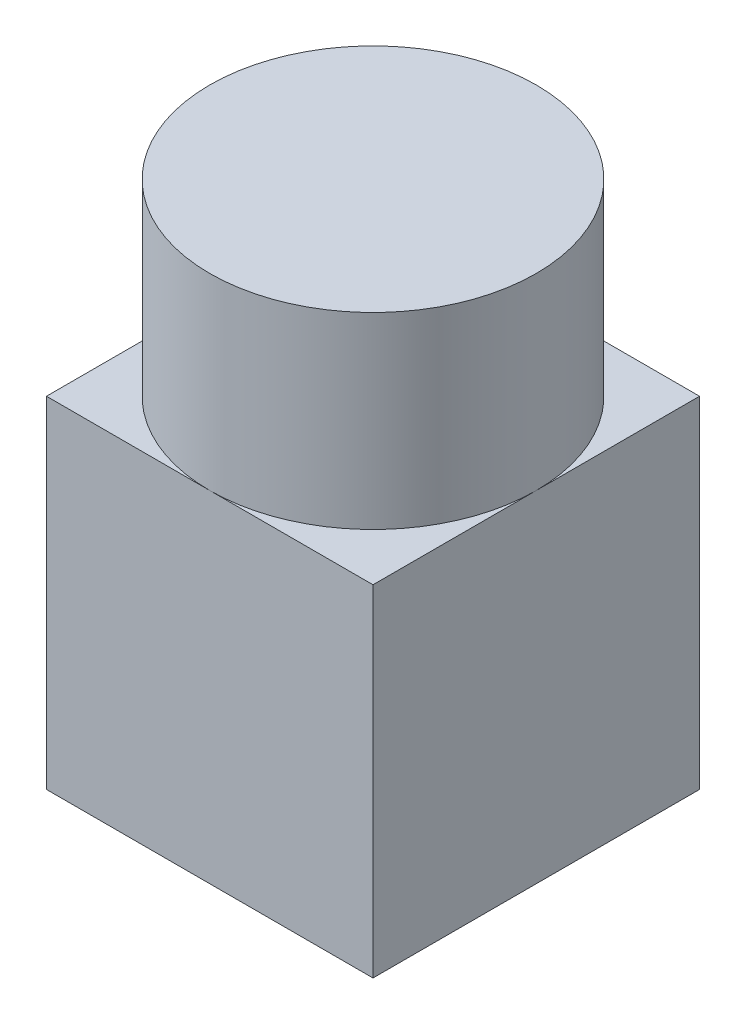
ISO-10303-21;
HEADER;
FILE_DESCRIPTION(('STEP AP214'),'2;1');
FILE_NAME('part.step','',(''),(''),'','','');
FILE_SCHEMA(('AUTOMOTIVE_DESIGN { 1 0 10303 214 1 1 1 1 }'));
ENDSEC;
DATA;
#1=APPLICATION_CONTEXT('core data for automotive mechanical design processes');
#2=APPLICATION_PROTOCOL_DEFINITION('international standard','automotive_design',2000,#1);
#3=PRODUCT_CONTEXT('',#1,'mechanical');
#4=PRODUCT('Part','Part','',(#3));
#5=PRODUCT_RELATED_PRODUCT_CATEGORY('part','',(#4));
#6=PRODUCT_DEFINITION_FORMATION('','',#4);
#7=PRODUCT_DEFINITION_CONTEXT('part definition',#1,'design');
#8=PRODUCT_DEFINITION('design','',#6,#7);
#9=PRODUCT_DEFINITION_SHAPE('','',#8);
#10=(LENGTH_UNIT() NAMED_UNIT(*) SI_UNIT(.MILLI.,.METRE.));
#11=(NAMED_UNIT(*) PLANE_ANGLE_UNIT() SI_UNIT($,.RADIAN.));
#12=(NAMED_UNIT(*) SI_UNIT($,.STERADIAN.) SOLID_ANGLE_UNIT());
#13=UNCERTAINTY_MEASURE_WITH_UNIT(LENGTH_MEASURE(1.E-05),#10,'distance_accuracy_value','');
#14=(GEOMETRIC_REPRESENTATION_CONTEXT(3) GLOBAL_UNCERTAINTY_ASSIGNED_CONTEXT((#13)) GLOBAL_UNIT_ASSIGNED_CONTEXT((#10,
#11,#12)) REPRESENTATION_CONTEXT('',''));
#15=CARTESIAN_POINT('',(0.,0.,0.));
#16=DIRECTION('',(0.,0.,1.));
#17=DIRECTION('',(1.,0.,0.));
#18=AXIS2_PLACEMENT_3D('',#15,#16,#17);
#19=CARTESIAN_POINT('',(0.,30.35,0.));
#20=DIRECTION('',(0.,1.,0.));
#21=DIRECTION('',(0.,0.,1.));
#22=AXIS2_PLACEMENT_3D('',#19,#20,#21);
#23=PLANE('',#22);
#24=CARTESIAN_POINT('',(0.,30.35,0.));
#25=DIRECTION('',(0.,1.,0.));
#26=DIRECTION('',(0.,0.,1.));
#27=AXIS2_PLACEMENT_3D('',#24,#25,#26);
#28=CIRCLE('',#27,14.55);
#29=CARTESIAN_POINT('',(0.,30.35,14.55));
#30=VERTEX_POINT('',#29);
#31=CARTESIAN_POINT('',(14.55,30.35,0.));
#32=VERTEX_POINT('',#31);
#33=EDGE_CURVE('E52',#30,#32,#28,.T.);
#34=ORIENTED_EDGE('',*,*,#33,.F.);
#35=DIRECTION('',(1.,0.,0.));
#36=VECTOR('',#35,1.);
#37=CARTESIAN_POINT('',(-14.55,30.35,14.55));
#38=LINE('',#37,#36);
#39=CARTESIAN_POINT('',(14.55,30.35,14.55));
#40=VERTEX_POINT('',#39);
#41=EDGE_CURVE('E103',#30,#40,#38,.T.);
#42=ORIENTED_EDGE('',*,*,#41,.T.);
#43=DIRECTION('',(0.,0.,-1.));
#44=VECTOR('',#43,1.);
#45=CARTESIAN_POINT('',(14.55,30.35,-14.55));
#46=LINE('',#45,#44);
#47=EDGE_CURVE('E114',#40,#32,#46,.T.);
#48=ORIENTED_EDGE('',*,*,#47,.T.);
#49=EDGE_LOOP('',(#34,#42,#48));
#50=FACE_BOUND('',#49,.T.);
#51=ADVANCED_FACE('F41',(#50),#23,.T.);
#52=CARTESIAN_POINT('',(0.,30.35,-14.55));
#53=VERTEX_POINT('',#52);
#54=EDGE_CURVE('E11',#32,#53,#28,.T.);
#55=ORIENTED_EDGE('',*,*,#54,.F.);
#56=CARTESIAN_POINT('',(14.55,30.35,-14.55));
#57=VERTEX_POINT('',#56);
#58=EDGE_CURVE('E124',#32,#57,#46,.T.);
#59=ORIENTED_EDGE('',*,*,#58,.T.);
#60=DIRECTION('',(-1.,0.,0.));
#61=VECTOR('',#60,1.);
#62=CARTESIAN_POINT('',(-14.55,30.35,-14.55));
#63=LINE('',#62,#61);
#64=EDGE_CURVE('E125',#57,#53,#63,.T.);
#65=ORIENTED_EDGE('',*,*,#64,.T.);
#66=EDGE_LOOP('',(#55,#59,#65));
#67=FACE_BOUND('',#66,.T.);
#68=ADVANCED_FACE('F156',(#67),#23,.T.);
#69=CARTESIAN_POINT('',(-14.55,30.35,0.));
#70=VERTEX_POINT('',#69);
#71=EDGE_CURVE('E50',#53,#70,#28,.T.);
#72=ORIENTED_EDGE('',*,*,#71,.F.);
#73=CARTESIAN_POINT('',(-14.55,30.35,-14.55));
#74=VERTEX_POINT('',#73);
#75=EDGE_CURVE('E123',#53,#74,#63,.T.);
#76=ORIENTED_EDGE('',*,*,#75,.T.);
#77=DIRECTION('',(0.,0.,1.));
#78=VECTOR('',#77,1.);
#79=CARTESIAN_POINT('',(-14.55,30.35,-14.55));
#80=LINE('',#79,#78);
#81=EDGE_CURVE('E112',#74,#70,#80,.T.);
#82=ORIENTED_EDGE('',*,*,#81,.T.);
#83=EDGE_LOOP('',(#72,#76,#82));
#84=FACE_BOUND('',#83,.T.);
#85=ADVANCED_FACE('F158',(#84),#23,.T.);
#86=CARTESIAN_POINT('',(14.55,30.35,-14.55));
#87=DIRECTION('',(-1.,0.,0.));
#88=DIRECTION('',(0.,0.,1.));
#89=AXIS2_PLACEMENT_3D('',#86,#87,#88);
#90=PLANE('',#89);
#91=DIRECTION('',(0.,0.,-1.));
#92=VECTOR('',#91,1.);
#93=CARTESIAN_POINT('',(14.55,0.,-14.55));
#94=LINE('',#93,#92);
#95=CARTESIAN_POINT('',(14.55,0.,14.55));
#96=VERTEX_POINT('',#95);
#97=CARTESIAN_POINT('',(14.55,0.,-14.55));
#98=VERTEX_POINT('',#97);
#99=EDGE_CURVE('E129',#96,#98,#94,.T.);
#100=ORIENTED_EDGE('',*,*,#99,.T.);
#101=DIRECTION('',(0.,-1.,0.));
#102=VECTOR('',#101,1.);
#103=CARTESIAN_POINT('',(14.55,30.35,-14.55));
#104=LINE('',#103,#102);
#105=EDGE_CURVE('E45',#57,#98,#104,.T.);
#106=ORIENTED_EDGE('',*,*,#105,.F.);
#107=ORIENTED_EDGE('',*,*,#58,.F.);
#108=ORIENTED_EDGE('',*,*,#47,.F.);
#109=DIRECTION('',(0.,-1.,0.));
#110=VECTOR('',#109,1.);
#111=CARTESIAN_POINT('',(14.55,30.35,14.55));
#112=LINE('',#111,#110);
#113=EDGE_CURVE('E102',#40,#96,#112,.T.);
#114=ORIENTED_EDGE('',*,*,#113,.T.);
#115=EDGE_LOOP('',(#100,#106,#107,#108,#114));
#116=FACE_BOUND('',#115,.T.);
#117=ADVANCED_FACE('F43',(#116),#90,.F.);
#118=CARTESIAN_POINT('',(-14.55,30.35,-14.55));
#119=DIRECTION('',(0.,0.,1.));
#120=DIRECTION('',(1.,0.,0.));
#121=AXIS2_PLACEMENT_3D('',#118,#119,#120);
#122=PLANE('',#121);
#123=DIRECTION('',(-1.,0.,0.));
#124=VECTOR('',#123,1.);
#125=CARTESIAN_POINT('',(-14.55,0.,-14.55));
#126=LINE('',#125,#124);
#127=CARTESIAN_POINT('',(-14.55,0.,-14.55));
#128=VERTEX_POINT('',#127);
#129=EDGE_CURVE('E132',#98,#128,#126,.T.);
#130=ORIENTED_EDGE('',*,*,#129,.T.);
#131=DIRECTION('',(0.,-1.,0.));
#132=VECTOR('',#131,1.);
#133=CARTESIAN_POINT('',(-14.55,30.35,-14.55));
#134=LINE('',#133,#132);
#135=EDGE_CURVE('E119',#74,#128,#134,.T.);
#136=ORIENTED_EDGE('',*,*,#135,.F.);
#137=ORIENTED_EDGE('',*,*,#75,.F.);
#138=ORIENTED_EDGE('',*,*,#64,.F.);
#139=ORIENTED_EDGE('',*,*,#105,.T.);
#140=EDGE_LOOP('',(#130,#136,#137,#138,#139));
#141=FACE_BOUND('',#140,.T.);
#142=ADVANCED_FACE('F157',(#141),#122,.F.);
#143=CARTESIAN_POINT('',(-14.55,30.35,-14.55));
#144=DIRECTION('',(1.,0.,0.));
#145=DIRECTION('',(0.,0.,-1.));
#146=AXIS2_PLACEMENT_3D('',#143,#144,#145);
#147=PLANE('',#146);
#148=DIRECTION('',(0.,0.,1.));
#149=VECTOR('',#148,1.);
#150=CARTESIAN_POINT('',(-14.55,0.,-14.55));
#151=LINE('',#150,#149);
#152=CARTESIAN_POINT('',(-14.55,0.,14.55));
#153=VERTEX_POINT('',#152);
#154=EDGE_CURVE('E134',#128,#153,#151,.T.);
#155=ORIENTED_EDGE('',*,*,#154,.T.);
#156=DIRECTION('',(0.,-1.,0.));
#157=VECTOR('',#156,1.);
#158=CARTESIAN_POINT('',(-14.55,30.35,14.55));
#159=LINE('',#158,#157);
#160=CARTESIAN_POINT('',(-14.55,30.35,14.55));
#161=VERTEX_POINT('',#160);
#162=EDGE_CURVE('E139',#161,#153,#159,.T.);
#163=ORIENTED_EDGE('',*,*,#162,.F.);
#164=EDGE_CURVE('E98',#70,#161,#80,.T.);
#165=ORIENTED_EDGE('',*,*,#164,.F.);
#166=ORIENTED_EDGE('',*,*,#81,.F.);
#167=ORIENTED_EDGE('',*,*,#135,.T.);
#168=EDGE_LOOP('',(#155,#163,#165,#166,#167));
#169=FACE_BOUND('',#168,.T.);
#170=ADVANCED_FACE('F145',(#169),#147,.F.);
#171=CARTESIAN_POINT('',(-14.55,30.35,14.55));
#172=DIRECTION('',(0.,0.,-1.));
#173=DIRECTION('',(-1.,0.,0.));
#174=AXIS2_PLACEMENT_3D('',#171,#172,#173);
#175=PLANE('',#174);
#176=DIRECTION('',(1.,0.,0.));
#177=VECTOR('',#176,1.);
#178=CARTESIAN_POINT('',(-14.55,0.,14.55));
#179=LINE('',#178,#177);
#180=EDGE_CURVE('E136',#153,#96,#179,.T.);
#181=ORIENTED_EDGE('',*,*,#180,.T.);
#182=ORIENTED_EDGE('',*,*,#113,.F.);
#183=ORIENTED_EDGE('',*,*,#41,.F.);
#184=EDGE_CURVE('E95',#161,#30,#38,.T.);
#185=ORIENTED_EDGE('',*,*,#184,.F.);
#186=ORIENTED_EDGE('',*,*,#162,.T.);
#187=EDGE_LOOP('',(#181,#182,#183,#185,#186));
#188=FACE_BOUND('',#187,.T.);
#189=ADVANCED_FACE('F107',(#188),#175,.F.);
#190=EDGE_CURVE('E59',#70,#30,#28,.T.);
#191=ORIENTED_EDGE('',*,*,#190,.F.);
#192=ORIENTED_EDGE('',*,*,#164,.T.);
#193=ORIENTED_EDGE('',*,*,#184,.T.);
#194=EDGE_LOOP('',(#191,#192,#193));
#195=FACE_BOUND('',#194,.T.);
#196=ADVANCED_FACE('F97',(#195),#23,.T.);
#197=CARTESIAN_POINT('',(0.,0.,0.));
#198=DIRECTION('',(0.,1.,0.));
#199=DIRECTION('',(0.,0.,1.));
#200=AXIS2_PLACEMENT_3D('',#197,#198,#199);
#201=PLANE('',#200);
#202=ORIENTED_EDGE('',*,*,#99,.F.);
#203=ORIENTED_EDGE('',*,*,#180,.F.);
#204=ORIENTED_EDGE('',*,*,#154,.F.);
#205=ORIENTED_EDGE('',*,*,#129,.F.);
#206=EDGE_LOOP('',(#202,#203,#204,#205));
#207=FACE_BOUND('',#206,.T.);
#208=ADVANCED_FACE('F150',(#207),#201,.F.);
#209=CARTESIAN_POINT('',(0.,47.1,0.));
#210=DIRECTION('',(0.,-1.,0.));
#211=DIRECTION('',(0.,0.,-1.));
#212=AXIS2_PLACEMENT_3D('',#209,#210,#211);
#213=CYLINDRICAL_SURFACE('',#212,14.55);
#214=CARTESIAN_POINT('',(0.,47.1,0.));
#215=DIRECTION('',(0.,1.,0.));
#216=DIRECTION('',(0.,0.,1.));
#217=AXIS2_PLACEMENT_3D('',#214,#215,#216);
#218=CIRCLE('',#217,14.55);
#219=CARTESIAN_POINT('',(0.,47.1,14.55));
#220=VERTEX_POINT('',#219);
#221=EDGE_CURVE('E116',#220,#220,#218,.T.);
#222=ORIENTED_EDGE('',*,*,#221,.F.);
#223=EDGE_LOOP('',(#222));
#224=FACE_BOUND('',#223,.T.);
#225=ORIENTED_EDGE('',*,*,#33,.T.);
#226=ORIENTED_EDGE('',*,*,#54,.T.);
#227=ORIENTED_EDGE('',*,*,#71,.T.);
#228=ORIENTED_EDGE('',*,*,#190,.T.);
#229=EDGE_LOOP('',(#225,#226,#227,#228));
#230=FACE_BOUND('',#229,.T.);
#231=ADVANCED_FACE('F117',(#224,#230),#213,.T.);
#232=CARTESIAN_POINT('',(0.,47.1,0.));
#233=DIRECTION('',(0.,1.,0.));
#234=DIRECTION('',(0.,0.,1.));
#235=AXIS2_PLACEMENT_3D('',#232,#233,#234);
#236=PLANE('',#235);
#237=ORIENTED_EDGE('',*,*,#221,.T.);
#238=EDGE_LOOP('',(#237));
#239=FACE_BOUND('',#238,.T.);
#240=ADVANCED_FACE('F193',(#239),#236,.T.);
#241=CLOSED_SHELL('',(#51,#68,#85,#117,#142,#170,#189,#196,#208,#231,#240));
#242=MANIFOLD_SOLID_BREP('B2',#241);
#243=ADVANCED_BREP_SHAPE_REPRESENTATION('',(#18,#242),#14);
#244=SHAPE_DEFINITION_REPRESENTATION(#9,#243);
ENDSEC;
END-ISO-10303-21;
